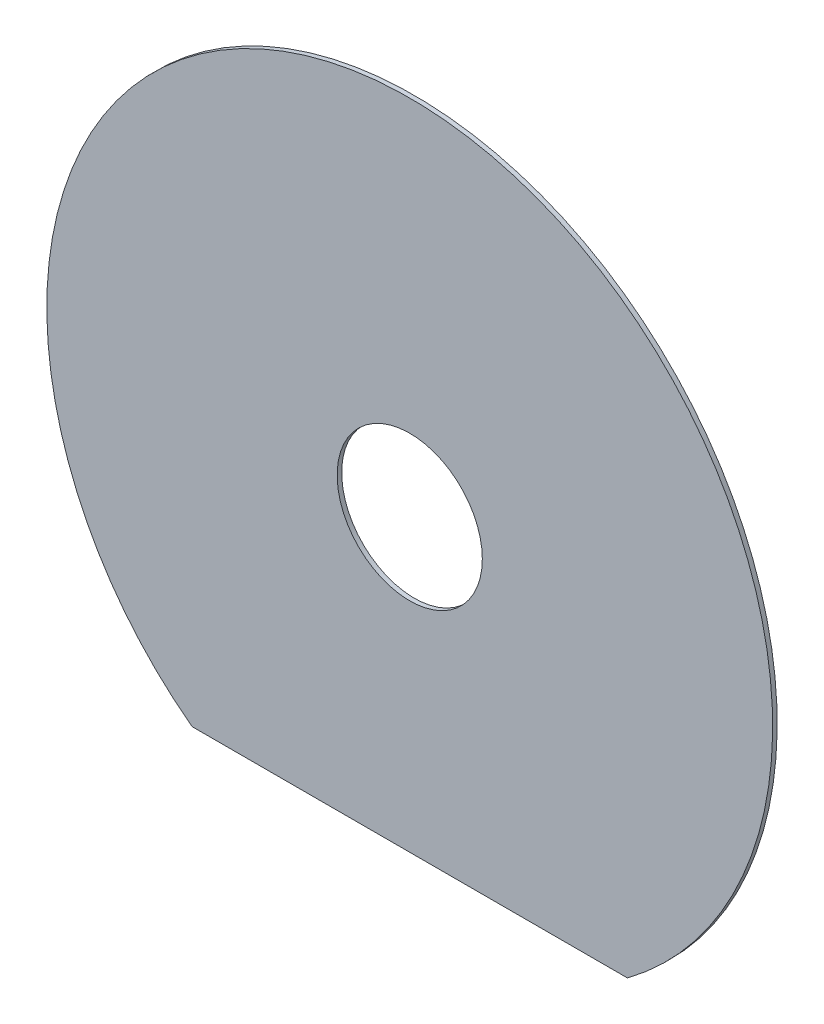
ISO-10303-21;
HEADER;
FILE_DESCRIPTION(('STEP AP214'),'2;1');
FILE_NAME('part.step','',(''),(''),'','','');
FILE_SCHEMA(('AUTOMOTIVE_DESIGN { 1 0 10303 214 1 1 1 1 }'));
ENDSEC;
DATA;
#1=APPLICATION_CONTEXT('core data for automotive mechanical design processes');
#2=APPLICATION_PROTOCOL_DEFINITION('international standard','automotive_design',2000,#1);
#3=PRODUCT_CONTEXT('',#1,'mechanical');
#4=PRODUCT('Part','Part','',(#3));
#5=PRODUCT_RELATED_PRODUCT_CATEGORY('part','',(#4));
#6=PRODUCT_DEFINITION_FORMATION('','',#4);
#7=PRODUCT_DEFINITION_CONTEXT('part definition',#1,'design');
#8=PRODUCT_DEFINITION('design','',#6,#7);
#9=PRODUCT_DEFINITION_SHAPE('','',#8);
#10=(LENGTH_UNIT() NAMED_UNIT(*) SI_UNIT(.MILLI.,.METRE.));
#11=(NAMED_UNIT(*) PLANE_ANGLE_UNIT() SI_UNIT($,.RADIAN.));
#12=(NAMED_UNIT(*) SI_UNIT($,.STERADIAN.) SOLID_ANGLE_UNIT());
#13=UNCERTAINTY_MEASURE_WITH_UNIT(LENGTH_MEASURE(1.E-05),#10,'distance_accuracy_value','');
#14=(GEOMETRIC_REPRESENTATION_CONTEXT(3) GLOBAL_UNCERTAINTY_ASSIGNED_CONTEXT((#13)) GLOBAL_UNIT_ASSIGNED_CONTEXT((#10,
#11,#12)) REPRESENTATION_CONTEXT('',''));
#15=CARTESIAN_POINT('',(0.,0.,0.));
#16=DIRECTION('',(0.,0.,1.));
#17=DIRECTION('',(1.,0.,0.));
#18=AXIS2_PLACEMENT_3D('',#15,#16,#17);
#19=CARTESIAN_POINT('',(0.,0.,3.175));
#20=DIRECTION('',(0.,0.,1.));
#21=DIRECTION('',(1.,0.,0.));
#22=AXIS2_PLACEMENT_3D('',#19,#20,#21);
#23=PLANE('',#22);
#24=CARTESIAN_POINT('',(0.,0.,3.175));
#25=DIRECTION('',(0.,0.,1.));
#26=DIRECTION('',(1.,0.,0.));
#27=AXIS2_PLACEMENT_3D('',#24,#25,#26);
#28=CIRCLE('',#27,254.);
#29=CARTESIAN_POINT('',(152.4,-203.2,3.175));
#30=VERTEX_POINT('',#29);
#31=CARTESIAN_POINT('',(-152.4,-203.2,3.175));
#32=VERTEX_POINT('',#31);
#33=EDGE_CURVE('E63',#30,#32,#28,.T.);
#34=ORIENTED_EDGE('',*,*,#33,.T.);
#35=DIRECTION('',(1.,0.,0.));
#36=VECTOR('',#35,1.);
#37=CARTESIAN_POINT('',(-152.4,-203.2,3.175));
#38=LINE('',#37,#36);
#39=EDGE_CURVE('E48',#32,#30,#38,.T.);
#40=ORIENTED_EDGE('',*,*,#39,.T.);
#41=EDGE_LOOP('',(#34,#40));
#42=FACE_BOUND('',#41,.T.);
#43=CARTESIAN_POINT('',(0.,0.,3.175));
#44=DIRECTION('',(0.,0.,1.));
#45=DIRECTION('',(1.,0.,0.));
#46=AXIS2_PLACEMENT_3D('',#43,#44,#45);
#47=CIRCLE('',#46,50.8);
#48=CARTESIAN_POINT('',(50.8,0.,3.175));
#49=VERTEX_POINT('',#48);
#50=EDGE_CURVE('E69',#49,#49,#47,.T.);
#51=ORIENTED_EDGE('',*,*,#50,.F.);
#52=EDGE_LOOP('',(#51));
#53=FACE_BOUND('',#52,.T.);
#54=ADVANCED_FACE('F32',(#42,#53),#23,.T.);
#55=CARTESIAN_POINT('',(0.,0.,0.));
#56=DIRECTION('',(0.,0.,1.));
#57=DIRECTION('',(1.,0.,0.));
#58=AXIS2_PLACEMENT_3D('',#55,#56,#57);
#59=PLANE('',#58);
#60=CARTESIAN_POINT('',(0.,0.,0.));
#61=DIRECTION('',(0.,0.,1.));
#62=DIRECTION('',(1.,0.,0.));
#63=AXIS2_PLACEMENT_3D('',#60,#61,#62);
#64=CIRCLE('',#63,254.);
#65=CARTESIAN_POINT('',(152.4,-203.2,0.));
#66=VERTEX_POINT('',#65);
#67=CARTESIAN_POINT('',(-152.4,-203.2,0.));
#68=VERTEX_POINT('',#67);
#69=EDGE_CURVE('E64',#66,#68,#64,.T.);
#70=ORIENTED_EDGE('',*,*,#69,.F.);
#71=DIRECTION('',(1.,0.,0.));
#72=VECTOR('',#71,1.);
#73=CARTESIAN_POINT('',(-152.4,-203.2,0.));
#74=LINE('',#73,#72);
#75=EDGE_CURVE('E56',#68,#66,#74,.T.);
#76=ORIENTED_EDGE('',*,*,#75,.F.);
#77=EDGE_LOOP('',(#70,#76));
#78=FACE_BOUND('',#77,.T.);
#79=CARTESIAN_POINT('',(0.,0.,0.));
#80=DIRECTION('',(0.,0.,1.));
#81=DIRECTION('',(1.,0.,0.));
#82=AXIS2_PLACEMENT_3D('',#79,#80,#81);
#83=CIRCLE('',#82,50.8);
#84=CARTESIAN_POINT('',(50.8,0.,0.));
#85=VERTEX_POINT('',#84);
#86=EDGE_CURVE('E72',#85,#85,#83,.T.);
#87=ORIENTED_EDGE('',*,*,#86,.T.);
#88=EDGE_LOOP('',(#87));
#89=FACE_BOUND('',#88,.T.);
#90=ADVANCED_FACE('F67',(#78,#89),#59,.F.);
#91=CARTESIAN_POINT('',(0.,0.,3.175));
#92=DIRECTION('',(0.,0.,-1.));
#93=DIRECTION('',(-1.,0.,0.));
#94=AXIS2_PLACEMENT_3D('',#91,#92,#93);
#95=CYLINDRICAL_SURFACE('',#94,254.);
#96=ORIENTED_EDGE('',*,*,#69,.T.);
#97=DIRECTION('',(0.,0.,-1.));
#98=VECTOR('',#97,1.);
#99=CARTESIAN_POINT('',(-152.4,-203.2,3.175));
#100=LINE('',#99,#98);
#101=EDGE_CURVE('E11',#32,#68,#100,.T.);
#102=ORIENTED_EDGE('',*,*,#101,.F.);
#103=ORIENTED_EDGE('',*,*,#33,.F.);
#104=DIRECTION('',(0.,0.,-1.));
#105=VECTOR('',#104,1.);
#106=CARTESIAN_POINT('',(152.4,-203.2,3.175));
#107=LINE('',#106,#105);
#108=EDGE_CURVE('E41',#30,#66,#107,.T.);
#109=ORIENTED_EDGE('',*,*,#108,.T.);
#110=EDGE_LOOP('',(#96,#102,#103,#109));
#111=FACE_BOUND('',#110,.T.);
#112=ADVANCED_FACE('F34',(#111),#95,.T.);
#113=CARTESIAN_POINT('',(-152.4,-203.2,3.175));
#114=DIRECTION('',(0.,1.,0.));
#115=DIRECTION('',(0.,0.,1.));
#116=AXIS2_PLACEMENT_3D('',#113,#114,#115);
#117=PLANE('',#116);
#118=ORIENTED_EDGE('',*,*,#75,.T.);
#119=ORIENTED_EDGE('',*,*,#108,.F.);
#120=ORIENTED_EDGE('',*,*,#39,.F.);
#121=ORIENTED_EDGE('',*,*,#101,.T.);
#122=EDGE_LOOP('',(#118,#119,#120,#121));
#123=FACE_BOUND('',#122,.T.);
#124=ADVANCED_FACE('F59',(#123),#117,.F.);
#125=CARTESIAN_POINT('',(0.,0.,3.175));
#126=DIRECTION('',(0.,0.,-1.));
#127=DIRECTION('',(-1.,0.,0.));
#128=AXIS2_PLACEMENT_3D('',#125,#126,#127);
#129=CYLINDRICAL_SURFACE('',#128,50.8);
#130=ORIENTED_EDGE('',*,*,#50,.T.);
#131=EDGE_LOOP('',(#130));
#132=FACE_BOUND('',#131,.T.);
#133=ORIENTED_EDGE('',*,*,#86,.F.);
#134=EDGE_LOOP('',(#133));
#135=FACE_BOUND('',#134,.T.);
#136=ADVANCED_FACE('F80',(#132,#135),#129,.F.);
#137=CLOSED_SHELL('',(#54,#90,#112,#124,#136));
#138=MANIFOLD_SOLID_BREP('B2',#137);
#139=ADVANCED_BREP_SHAPE_REPRESENTATION('',(#18,#138),#14);
#140=SHAPE_DEFINITION_REPRESENTATION(#9,#139);
ENDSEC;
END-ISO-10303-21;
